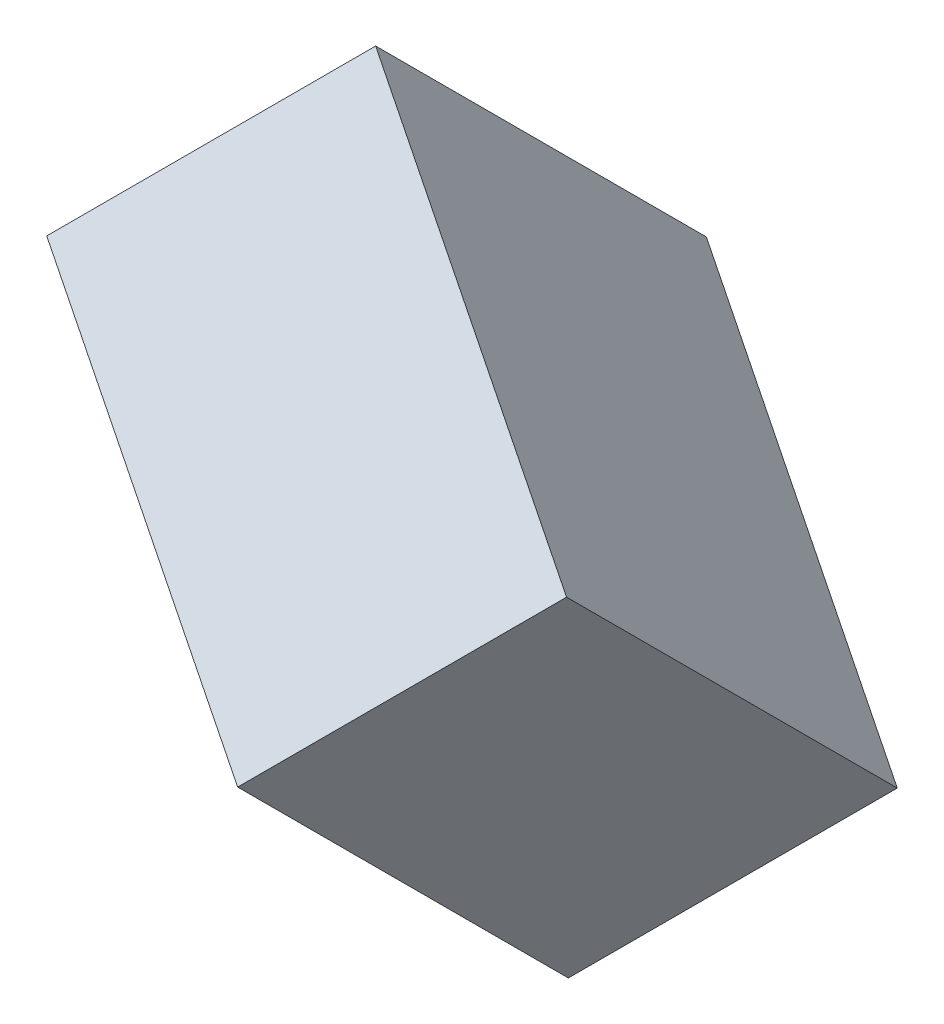
ISO-10303-21;
HEADER;
FILE_DESCRIPTION(('STEP AP214'),'2;1');
FILE_NAME('part.step','',(''),(''),'','','');
FILE_SCHEMA(('AUTOMOTIVE_DESIGN { 1 0 10303 214 1 1 1 1 }'));
ENDSEC;
DATA;
#1=APPLICATION_CONTEXT('core data for automotive mechanical design processes');
#2=APPLICATION_PROTOCOL_DEFINITION('international standard','automotive_design',2000,#1);
#3=PRODUCT_CONTEXT('',#1,'mechanical');
#4=PRODUCT('Part','Part','',(#3));
#5=PRODUCT_RELATED_PRODUCT_CATEGORY('part','',(#4));
#6=PRODUCT_DEFINITION_FORMATION('','',#4);
#7=PRODUCT_DEFINITION_CONTEXT('part definition',#1,'design');
#8=PRODUCT_DEFINITION('design','',#6,#7);
#9=PRODUCT_DEFINITION_SHAPE('','',#8);
#10=(LENGTH_UNIT() NAMED_UNIT(*) SI_UNIT(.MILLI.,.METRE.));
#11=(NAMED_UNIT(*) PLANE_ANGLE_UNIT() SI_UNIT($,.RADIAN.));
#12=(NAMED_UNIT(*) SI_UNIT($,.STERADIAN.) SOLID_ANGLE_UNIT());
#13=UNCERTAINTY_MEASURE_WITH_UNIT(LENGTH_MEASURE(1.E-05),#10,'distance_accuracy_value','');
#14=(GEOMETRIC_REPRESENTATION_CONTEXT(3) GLOBAL_UNCERTAINTY_ASSIGNED_CONTEXT((#13)) GLOBAL_UNIT_ASSIGNED_CONTEXT((#10,
#11,#12)) REPRESENTATION_CONTEXT('',''));
#15=CARTESIAN_POINT('',(0.,0.,0.));
#16=DIRECTION('',(0.,0.,1.));
#17=DIRECTION('',(1.,0.,0.));
#18=AXIS2_PLACEMENT_3D('',#15,#16,#17);
#19=CARTESIAN_POINT('',(22.8158049250269,22.8158059363306,-22.8157720901868));
#20=DIRECTION('',(-0.577350537619435,-0.577350563210324,0.577349706738708));
#21=DIRECTION('',(0.707106796857695,-0.7071067655154,0.));
#22=AXIS2_PLACEMENT_3D('',#19,#20,#21);
#23=PLANE('',#22);
#24=DIRECTION('',(-0.707106272377781,0.,-0.707107289994949));
#25=VECTOR('',#24,1.);
#26=CARTESIAN_POINT('',(9.04658788701765,50.3541991604437,-9.04657486782906));
#27=LINE('',#26,#25);
#28=CARTESIAN_POINT('',(24.8615788817128,50.3541991604437,6.76843888667884));
#29=VERTEX_POINT('',#28);
#30=CARTESIAN_POINT('',(-8.80153690732209,50.3541991604437,-26.8947253479234));
#31=VERTEX_POINT('',#30);
#32=EDGE_CURVE('E304',#29,#31,#27,.T.);
#33=ORIENTED_EDGE('',*,*,#32,.F.);
#34=DIRECTION('',(0.,0.707106256706622,0.707107305666085));
#35=VECTOR('',#34,1.);
#36=CARTESIAN_POINT('',(24.8615788817128,21.7929174859225,-21.7928851571842));
#37=LINE('',#36,#35);
#38=CARTESIAN_POINT('',(24.8615788817128,16.6910848635162,-26.8947253479235));
#39=VERTEX_POINT('',#38);
#40=EDGE_CURVE('E338',#39,#29,#37,.T.);
#41=ORIENTED_EDGE('',*,*,#40,.F.);
#42=DIRECTION('',(0.707106796857694,-0.7071067655154,0.));
#43=VECTOR('',#42,1.);
#44=CARTESIAN_POINT('',(20.7763313216235,20.7763322425281,-26.8947253479235));
#45=LINE('',#44,#43);
#46=EDGE_CURVE('E333',#31,#39,#45,.T.);
#47=ORIENTED_EDGE('',*,*,#46,.F.);
#48=EDGE_LOOP('',(#33,#41,#47));
#49=FACE_BOUND('',#48,.T.);
#50=DIRECTION('',(0.,0.707106256706622,0.707107305666085));
#51=VECTOR('',#50,1.);
#52=CARTESIAN_POINT('',(36.0941758460175,8.460881224255,-23.8923280668504));
#53=LINE('',#52,#51);
#54=CARTESIAN_POINT('',(36.0941758460175,8.460881224255,-23.8923280668504));
#55=VERTEX_POINT('',#54);
#56=CARTESIAN_POINT('',(36.0941758460174,47.3517253431192,14.9985737447843));
#57=VERTEX_POINT('',#56);
#58=EDGE_CURVE('E307',#55,#57,#53,.T.);
#59=ORIENTED_EDGE('',*,*,#58,.T.);
#60=DIRECTION('',(-0.816496391119122,0.408248783080944,-0.408248177463634));
#61=VECTOR('',#60,1.);
#62=CARTESIAN_POINT('',(36.0941758460174,47.3517253431192,14.9985737447843));
#63=LINE('',#62,#61);
#64=CARTESIAN_POINT('',(-8.81312566553424,69.8054084125711,-7.45507601571559));
#65=VERTEX_POINT('',#64);
#66=EDGE_CURVE('E309',#57,#65,#63,.T.);
#67=ORIENTED_EDGE('',*,*,#66,.T.);
#68=DIRECTION('',(0.,-0.707106256706621,-0.707107305666085));
#69=VECTOR('',#68,1.);
#70=CARTESIAN_POINT('',(-8.81312566553425,30.9145642937069,-46.3459778273503));
#71=LINE('',#70,#69);
#72=CARTESIAN_POINT('',(-8.81312566553425,30.9145642937069,-46.3459778273503));
#73=VERTEX_POINT('',#72);
#74=EDGE_CURVE('E403',#65,#73,#71,.T.);
#75=ORIENTED_EDGE('',*,*,#74,.T.);
#76=DIRECTION('',(0.816496391119122,-0.408248783080944,0.408248177463634));
#77=VECTOR('',#76,1.);
#78=CARTESIAN_POINT('',(36.0941758460175,8.460881224255,-23.8923280668504));
#79=LINE('',#78,#77);
#80=EDGE_CURVE('E312',#73,#55,#79,.T.);
#81=ORIENTED_EDGE('',*,*,#80,.T.);
#82=EDGE_LOOP('',(#59,#67,#75,#81));
#83=FACE_BOUND('',#82,.T.);
#84=ADVANCED_FACE('F43',(#49,#83),#23,.T.);
#85=CARTESIAN_POINT('',(36.0941758460175,8.460881224255,-23.8923280668504));
#86=DIRECTION('',(-0.816496391119122,0.408248783080944,-0.408248177463634));
#87=DIRECTION('',(-0.447214110377798,-0.89442693356081,0.));
#88=AXIS2_PLACEMENT_3D('',#85,#86,#87);
#89=PLANE('',#88);
#90=DIRECTION('',(0.,0.707106256706622,0.707107305666085));
#91=VECTOR('',#90,1.);
#92=CARTESIAN_POINT('',(55.4354188562685,27.8021250918008,-43.2335432425971));
#93=LINE('',#92,#91);
#94=CARTESIAN_POINT('',(55.4354188562685,27.8021250918008,-43.2335432425971));
#95=VERTEX_POINT('',#94);
#96=CARTESIAN_POINT('',(55.4354188562685,66.692969210665,-4.34264143096244));
#97=VERTEX_POINT('',#96);
#98=EDGE_CURVE('E320',#95,#97,#93,.T.);
#99=ORIENTED_EDGE('',*,*,#98,.T.);
#100=DIRECTION('',(0.577350537619435,0.577350563210324,-0.577349706738708));
#101=VECTOR('',#100,1.);
#102=CARTESIAN_POINT('',(36.0941758460174,47.3517253431192,14.9985737447843));
#103=LINE('',#102,#101);
#104=EDGE_CURVE('E318',#57,#97,#103,.T.);
#105=ORIENTED_EDGE('',*,*,#104,.F.);
#106=ORIENTED_EDGE('',*,*,#58,.F.);
#107=DIRECTION('',(0.577350537619435,0.577350563210324,-0.577349706738708));
#108=VECTOR('',#107,1.);
#109=CARTESIAN_POINT('',(36.0941758460175,8.460881224255,-23.8923280668504));
#110=LINE('',#109,#108);
#111=EDGE_CURVE('E327',#55,#95,#110,.T.);
#112=ORIENTED_EDGE('',*,*,#111,.T.);
#113=EDGE_LOOP('',(#99,#105,#106,#112));
#114=FACE_BOUND('',#113,.T.);
#115=ADVANCED_FACE('F248',(#114),#89,.F.);
#116=CARTESIAN_POINT('',(36.0941758460174,47.3517253431192,14.9985737447843));
#117=DIRECTION('',(0.,-0.707106256706621,-0.707107305666084));
#118=DIRECTION('',(0.,0.707107305666085,-0.707106256706622));
#119=AXIS2_PLACEMENT_3D('',#116,#117,#118);
#120=PLANE('',#119);
#121=DIRECTION('',(-0.816496391119122,0.408248783080944,-0.408248177463634));
#122=VECTOR('',#121,1.);
#123=CARTESIAN_POINT('',(55.4354188562685,66.692969210665,-4.34264143096244));
#124=LINE('',#123,#122);
#125=CARTESIAN_POINT('',(10.5281173447168,89.1466522801169,-26.7962911914623));
#126=VERTEX_POINT('',#125);
#127=EDGE_CURVE('E323',#97,#126,#124,.T.);
#128=ORIENTED_EDGE('',*,*,#127,.T.);
#129=DIRECTION('',(0.577350537619435,0.577350563210324,-0.577349706738708));
#130=VECTOR('',#129,1.);
#131=CARTESIAN_POINT('',(-8.81312566553424,69.8054084125711,-7.45507601571559));
#132=LINE('',#131,#130);
#133=EDGE_CURVE('E325',#65,#126,#132,.T.);
#134=ORIENTED_EDGE('',*,*,#133,.F.);
#135=ORIENTED_EDGE('',*,*,#66,.F.);
#136=ORIENTED_EDGE('',*,*,#104,.T.);
#137=EDGE_LOOP('',(#128,#134,#135,#136));
#138=FACE_BOUND('',#137,.T.);
#139=ADVANCED_FACE('F298',(#138),#120,.F.);
#140=CARTESIAN_POINT('',(-8.81312566553425,30.9145642937069,-46.3459778273503));
#141=DIRECTION('',(0.816496391119122,-0.408248783080944,0.408248177463634));
#142=DIRECTION('',(0.447214110377799,0.89442693356081,0.));
#143=AXIS2_PLACEMENT_3D('',#140,#141,#142);
#144=PLANE('',#143);
#145=DIRECTION('',(0.,-0.707106256706621,-0.707107305666085));
#146=VECTOR('',#145,1.);
#147=CARTESIAN_POINT('',(10.5281173447168,50.2558081612528,-65.687193003097));
#148=LINE('',#147,#146);
#149=CARTESIAN_POINT('',(10.5281173447168,50.2558081612528,-65.687193003097));
#150=VERTEX_POINT('',#149);
#151=EDGE_CURVE('E322',#126,#150,#148,.T.);
#152=ORIENTED_EDGE('',*,*,#151,.T.);
#153=DIRECTION('',(0.577350537619435,0.577350563210324,-0.577349706738708));
#154=VECTOR('',#153,1.);
#155=CARTESIAN_POINT('',(-8.81312566553425,30.9145642937069,-46.3459778273503));
#156=LINE('',#155,#154);
#157=EDGE_CURVE('E337',#73,#150,#156,.T.);
#158=ORIENTED_EDGE('',*,*,#157,.F.);
#159=ORIENTED_EDGE('',*,*,#74,.F.);
#160=ORIENTED_EDGE('',*,*,#133,.T.);
#161=EDGE_LOOP('',(#152,#158,#159,#160));
#162=FACE_BOUND('',#161,.T.);
#163=ADVANCED_FACE('F420',(#162),#144,.F.);
#164=CARTESIAN_POINT('',(36.0941758460175,8.460881224255,-23.8923280668504));
#165=DIRECTION('',(0.,0.707106256706621,0.707107305666085));
#166=DIRECTION('',(0.,-0.707107305666085,0.707106256706621));
#167=AXIS2_PLACEMENT_3D('',#164,#165,#166);
#168=PLANE('',#167);
#169=DIRECTION('',(0.816496391119122,-0.408248783080944,0.408248177463634));
#170=VECTOR('',#169,1.);
#171=CARTESIAN_POINT('',(55.4354188562685,27.8021250918008,-43.2335432425971));
#172=LINE('',#171,#170);
#173=EDGE_CURVE('E407',#150,#95,#172,.T.);
#174=ORIENTED_EDGE('',*,*,#173,.T.);
#175=ORIENTED_EDGE('',*,*,#111,.F.);
#176=ORIENTED_EDGE('',*,*,#80,.F.);
#177=ORIENTED_EDGE('',*,*,#157,.T.);
#178=EDGE_LOOP('',(#174,#175,#176,#177));
#179=FACE_BOUND('',#178,.T.);
#180=ADVANCED_FACE('F413',(#179),#168,.F.);
#181=CARTESIAN_POINT('',(42.157047935278,42.1570498038765,-42.1569872659335));
#182=DIRECTION('',(-0.577350537619435,-0.577350563210324,0.577349706738708));
#183=DIRECTION('',(0.707106796857695,-0.7071067655154,0.));
#184=AXIS2_PLACEMENT_3D('',#181,#182,#183);
#185=PLANE('',#184);
#186=ORIENTED_EDGE('',*,*,#98,.F.);
#187=ORIENTED_EDGE('',*,*,#173,.F.);
#188=ORIENTED_EDGE('',*,*,#151,.F.);
#189=ORIENTED_EDGE('',*,*,#127,.F.);
#190=EDGE_LOOP('',(#186,#187,#188,#189));
#191=FACE_BOUND('',#190,.T.);
#192=ADVANCED_FACE('F418',(#191),#185,.F.);
#193=CARTESIAN_POINT('',(24.8615788817128,23.0541991604437,-26.8947253479235));
#194=DIRECTION('',(0.,0.,-1.));
#195=DIRECTION('',(0.,1.,0.));
#196=AXIS2_PLACEMENT_3D('',#193,#194,#195);
#197=PLANE('',#196);
#198=CARTESIAN_POINT('',(8.3615660689426,35.8541862944833,-26.8947253479235));
#199=CARTESIAN_POINT('',(8.36156639598209,35.7987452668269,-26.8947253479235));
#200=CARTESIAN_POINT('',(8.36387267016577,35.7433300835326,-26.8947253479235));
#201=CARTESIAN_POINT('',(8.37307416502283,35.6328845206701,-26.8947253479235));
#202=CARTESIAN_POINT('',(8.37996918599046,35.5778541244608,-26.8947253479235));
#203=CARTESIAN_POINT('',(8.40748778761155,35.4139246170889,-26.8947253479235));
#204=CARTESIAN_POINT('',(8.4349449910057,35.3060926576647,-26.8947253479235));
#205=CARTESIAN_POINT('',(8.50731573317348,35.0965152093663,-26.8947253479235));
#206=CARTESIAN_POINT('',(8.55222926268645,34.9947697172632,-26.8947253479235));
#207=CARTESIAN_POINT('',(8.65827929856678,34.8001004585484,-26.8947253479235));
#208=CARTESIAN_POINT('',(8.71941579645956,34.7071766873284,-26.8947253479235));
#209=CARTESIAN_POINT('',(8.85622338243988,34.5327329648341,-26.8947253479235));
#210=CARTESIAN_POINT('',(8.93189446388477,34.451213008348,-26.8947253479235));
#211=CARTESIAN_POINT('',(9.09568725059705,34.301819760747,-26.8947253479235));
#212=CARTESIAN_POINT('',(9.1838089516114,34.2339464649705,-26.8947253479235));
#213=CARTESIAN_POINT('',(9.37006201496507,34.1137216758363,-26.8947253479235));
#214=CARTESIAN_POINT('',(9.46819337541521,34.0613701795492,-26.8947253479235));
#215=CARTESIAN_POINT('',(9.67179782978168,33.9736259908587,-26.8947253479234));
#216=CARTESIAN_POINT('',(9.77727092358642,33.9382332981975,-26.8947253479235));
#217=CARTESIAN_POINT('',(9.9627621583997,33.8927074563183,-26.8947253479235));
#218=CARTESIAN_POINT('',(10.0417588364109,33.8782965694851,-26.8947253479235));
#219=CARTESIAN_POINT('',(10.2010131149251,33.8590205959407,-26.8947253479234));
#220=CARTESIAN_POINT('',(10.281272232858,33.8541680497576,-26.8947253479234));
#221=CARTESIAN_POINT('',(10.3615645398647,33.8541847654057,-26.8947253479233));
#222=B_SPLINE_CURVE_WITH_KNOTS('',3,(#198,#199,#200,#201,#202,#203,#204,#205,#206,#207,#208,
#209,#210,#211,#212,#213,#214,#215,#216,#217,#218,#219,#220,#221),.UNSPECIFIED.,.F.,.F.,(4,2,2,
2,2,2,2,2,2,2,2,4),(0.,0.166223775937425,0.332440318162865,0.664593321477084,0.996746148582956,
1.32889880217869,1.66105130397308,1.9932036923069,2.3253560179521,2.65750833854907,
2.89785994379603,3.13852668049027),.UNSPECIFIED.);
#223=CARTESIAN_POINT('',(8.36156606894261,35.8541862944833,-26.8947253479235));
#224=VERTEX_POINT('',#223);
#225=CARTESIAN_POINT('',(10.3615645398649,33.8541847654059,-26.8947253479235));
#226=VERTEX_POINT('',#225);
#227=EDGE_CURVE('E200',#224,#226,#222,.T.);
#228=ORIENTED_EDGE('',*,*,#227,.F.);
#229=DIRECTION('',(-7.64538399963104E-07,-0.999999999999708,0.));
#230=VECTOR('',#229,1.);
#231=CARTESIAN_POINT('',(8.36160892436794,91.9081730138131,-26.8947253479235));
#232=LINE('',#231,#230);
#233=CARTESIAN_POINT('',(8.36158316064785,50.3541991604437,-26.8947253479234));
#234=VERTEX_POINT('',#233);
#235=EDGE_CURVE('E188',#234,#224,#232,.T.);
#236=ORIENTED_EDGE('',*,*,#235,.F.);
#237=DIRECTION('',(1.,0.,0.));
#238=VECTOR('',#237,1.);
#239=CARTESIAN_POINT('',(-2.43842111828726,50.3541991604437,-26.8947253479234));
#240=LINE('',#239,#238);
#241=EDGE_CURVE('E187',#31,#234,#240,.T.);
#242=ORIENTED_EDGE('',*,*,#241,.F.);
#243=ORIENTED_EDGE('',*,*,#46,.T.);
#244=DIRECTION('',(0.,1.,0.));
#245=VECTOR('',#244,1.);
#246=CARTESIAN_POINT('',(24.8615788817128,23.0541991604437,-26.8947253479235));
#247=LINE('',#246,#245);
#248=CARTESIAN_POINT('',(24.8615717135476,33.8541919390886,-26.8947253479235));
#249=VERTEX_POINT('',#248);
#250=EDGE_CURVE('E336',#39,#249,#247,.T.);
#251=ORIENTED_EDGE('',*,*,#250,.T.);
#252=DIRECTION('',(1.,0.,0.));
#253=VECTOR('',#252,1.);
#254=CARTESIAN_POINT('',(61.0821843638305,33.8541847709232,-26.8947253479235));
#255=LINE('',#254,#253);
#256=EDGE_CURVE('E203',#226,#249,#255,.T.);
#257=ORIENTED_EDGE('',*,*,#256,.F.);
#258=EDGE_LOOP('',(#228,#236,#242,#243,#251,#257));
#259=FACE_BOUND('',#258,.T.);
#260=ADVANCED_FACE('F431',(#259),#197,.F.);
#261=CARTESIAN_POINT('',(24.8615788817128,23.0541991604437,-21.2947253479234));
#262=DIRECTION('',(1.,0.,0.));
#263=DIRECTION('',(0.,0.,-1.));
#264=AXIS2_PLACEMENT_3D('',#261,#262,#263);
#265=PLANE('',#264);
#266=CARTESIAN_POINT('',(24.8615788817128,33.854199107254,-12.3947270748758));
#267=CARTESIAN_POINT('',(24.8615788817128,33.8541994766617,-12.3392861201116));
#268=CARTESIAN_POINT('',(24.8615788817128,33.856505790691,-12.2838710115079));
#269=CARTESIAN_POINT('',(24.8615788817128,33.865707358914,-12.1734256012896));
#270=CARTESIAN_POINT('',(24.8615788817128,33.8726024133831,-12.1183952830323));
#271=CARTESIAN_POINT('',(24.8615788817128,33.9001211128774,-11.9544659605401));
#272=CARTESIAN_POINT('',(24.8615788817128,33.9275783780362,-11.8466341131094));
#273=CARTESIAN_POINT('',(24.8615788817128,33.9999492389686,-11.637056840295));
#274=CARTESIAN_POINT('',(24.8615788817128,34.0448628347422,-11.5353114149114));
#275=CARTESIAN_POINT('',(24.8615788817128,34.1509130145123,-11.3406422464367));
#276=CARTESIAN_POINT('',(24.8615788817128,34.2120495985086,-11.2477185033455));
#277=CARTESIAN_POINT('',(24.8615788817128,34.3488573784668,-11.0732748082205));
#278=CARTESIAN_POINT('',(24.8615788817128,34.4245285744286,-10.9917548561867));
#279=CARTESIAN_POINT('',(24.8615788817128,34.5883216133369,-10.8423616080331));
#280=CARTESIAN_POINT('',(24.8615788817128,34.6764434562833,-10.7744883119134));
#281=CARTESIAN_POINT('',(24.8615788817128,34.8626968177849,-10.6542635320934));
#282=CARTESIAN_POINT('',(24.8615788817128,34.9608283363401,-10.6019120483932));
#283=CARTESIAN_POINT('',(24.8615788817128,35.164433104187,-10.5141679093016));
#284=CARTESIAN_POINT('',(24.8615788817128,35.2699063534786,-10.4787752539103));
#285=CARTESIAN_POINT('',(24.8615788817128,35.4553975841986,-10.4332495633614));
#286=CARTESIAN_POINT('',(24.8615788817128,35.5343940972097,-10.4188387525381));
#287=CARTESIAN_POINT('',(24.8615788817128,35.6936480345179,-10.3995628805369));
#288=CARTESIAN_POINT('',(24.8615788817127,35.7739069762144,-10.3947103596756));
#289=CARTESIAN_POINT('',(24.8615788817126,35.8541991072538,-10.3947270748757));
#290=B_SPLINE_CURVE_WITH_KNOTS('',3,(#266,#267,#268,#269,#270,#271,#272,#273,#274,#275,#276,
#277,#278,#279,#280,#281,#282,#283,#284,#285,#286,#287,#288,#289),.UNSPECIFIED.,.F.,.F.,(4,2,2,
2,2,2,2,2,2,2,2,4),(0.,0.16622355727992,0.332439880167641,0.664592604927288,0.996745329686934,
1.32889805444657,1.66105077920621,1.99320350396585,2.3253562287255,2.65750895348513,
2.89786003593041,3.13852624549417),.UNSPECIFIED.);
#291=CARTESIAN_POINT('',(24.8615788817128,33.854199107254,-12.3947270748758));
#292=VERTEX_POINT('',#291);
#293=CARTESIAN_POINT('',(24.8615788817128,35.854199107254,-10.3947270748758));
#294=VERTEX_POINT('',#293);
#295=EDGE_CURVE('E275',#292,#294,#290,.T.);
#296=ORIENTED_EDGE('',*,*,#295,.F.);
#297=DIRECTION('',(0.,0.,1.));
#298=VECTOR('',#297,1.);
#299=CARTESIAN_POINT('',(24.8615788817127,33.854199107254,-68.4486162186449));
#300=LINE('',#299,#298);
#301=EDGE_CURVE('E207',#249,#292,#300,.T.);
#302=ORIENTED_EDGE('',*,*,#301,.F.);
#303=ORIENTED_EDGE('',*,*,#250,.F.);
#304=ORIENTED_EDGE('',*,*,#40,.T.);
#305=DIRECTION('',(0.,0.,-1.));
#306=VECTOR('',#305,1.);
#307=CARTESIAN_POINT('',(24.8615788817128,50.3541991604437,0.40527465207656));
#308=LINE('',#307,#306);
#309=CARTESIAN_POINT('',(24.8615789349024,50.3541991604437,-10.3947271280653));
#310=VERTEX_POINT('',#309);
#311=EDGE_CURVE('E340',#29,#310,#308,.T.);
#312=ORIENTED_EDGE('',*,*,#311,.T.);
#313=DIRECTION('',(0.,1.,0.));
#314=VECTOR('',#313,1.);
#315=CARTESIAN_POINT('',(24.8615788817128,82.2414715852165,-10.3947270748758));
#316=LINE('',#315,#314);
#317=EDGE_CURVE('E211',#294,#310,#316,.T.);
#318=ORIENTED_EDGE('',*,*,#317,.F.);
#319=EDGE_LOOP('',(#296,#302,#303,#304,#312,#318));
#320=FACE_BOUND('',#319,.T.);
#321=ADVANCED_FACE('F432',(#320),#265,.F.);
#322=CARTESIAN_POINT('',(-2.43842111828726,50.3541991604437,-26.8947253479234));
#323=DIRECTION('',(0.,1.,0.));
#324=DIRECTION('',(-1.,0.,0.));
#325=AXIS2_PLACEMENT_3D('',#322,#323,#324);
#326=PLANE('',#325);
#327=ORIENTED_EDGE('',*,*,#241,.T.);
#328=DIRECTION('',(-7.6453843470117E-07,0.,-0.999999999999708));
#329=VECTOR('',#328,1.);
#330=CARTESIAN_POINT('',(8.36155124292705,50.3541991604436,-63.1152413475106));
#331=LINE('',#330,#329);
#332=CARTESIAN_POINT('',(8.36158505120041,50.3541991604437,-18.894739360653));
#333=VERTEX_POINT('',#332);
#334=EDGE_CURVE('E168',#333,#234,#331,.T.);
#335=ORIENTED_EDGE('',*,*,#334,.F.);
#336=DIRECTION('',(9.40967159604717E-07,0.,-0.999999999999557));
#337=VECTOR('',#336,1.);
#338=CARTESIAN_POINT('',(8.36162258377936,50.3541991604436,-58.7819751336039));
#339=LINE('',#338,#337);
#340=CARTESIAN_POINT('',(8.36157893490237,50.3541991604437,-12.3947271280653));
#341=VERTEX_POINT('',#340);
#342=EDGE_CURVE('E178',#341,#333,#339,.T.);
#343=ORIENTED_EDGE('',*,*,#342,.F.);
#344=CARTESIAN_POINT('',(10.3615789349024,50.3541991604437,-10.3947271280653));
#345=CARTESIAN_POINT('',(10.3061379801381,50.3541991604437,-10.394727497473));
#346=CARTESIAN_POINT('',(10.2507228715345,50.3541991604437,-10.3970338115023));
#347=CARTESIAN_POINT('',(10.1402774613162,50.3541991604437,-10.4062353797253));
#348=CARTESIAN_POINT('',(10.0852471430589,50.3541991604437,-10.4131304341944));
#349=CARTESIAN_POINT('',(9.92131782056662,50.3541991604437,-10.4406491336887));
#350=CARTESIAN_POINT('',(9.81348597313592,50.3541991604437,-10.4681063988475));
#351=CARTESIAN_POINT('',(9.60390870032162,50.3541991604437,-10.5404772597799));
#352=CARTESIAN_POINT('',(9.50216327493802,50.3541991604437,-10.5853908555535));
#353=CARTESIAN_POINT('',(9.30749410646326,50.3541991604437,-10.6914410353236));
#354=CARTESIAN_POINT('',(9.21457036337211,50.3541991604437,-10.7525776193199));
#355=CARTESIAN_POINT('',(9.04012666824713,50.3541991604437,-10.8893853992781));
#356=CARTESIAN_POINT('',(8.95860671621329,50.3541991604437,-10.9650565952399));
#357=CARTESIAN_POINT('',(8.80921346805971,50.3541991604437,-11.1288496341482));
#358=CARTESIAN_POINT('',(8.74134017193995,50.3541991604437,-11.2169714770946));
#359=CARTESIAN_POINT('',(8.62111539211997,50.3541991604437,-11.4032248385962));
#360=CARTESIAN_POINT('',(8.56876390841973,50.3541991604437,-11.5013563571514));
#361=CARTESIAN_POINT('',(8.48101976932818,50.3541991604437,-11.7049611249983));
#362=CARTESIAN_POINT('',(8.44562711393685,50.3541991604437,-11.8104343742899));
#363=CARTESIAN_POINT('',(8.400101423388,50.3541991604437,-11.9959256050099));
#364=CARTESIAN_POINT('',(8.38569061256466,50.3541991604437,-12.074922118021));
#365=CARTESIAN_POINT('',(8.36641474056348,50.3541991604437,-12.2341760553292));
#366=CARTESIAN_POINT('',(8.36156221970215,50.3541991604436,-12.3144349970257));
#367=CARTESIAN_POINT('',(8.36157893490223,50.3541991604435,-12.3947271280651));
#368=B_SPLINE_CURVE_WITH_KNOTS('',3,(#344,#345,#346,#347,#348,#349,#350,#351,#352,#353,#354,
#355,#356,#357,#358,#359,#360,#361,#362,#363,#364,#365,#366,#367),.UNSPECIFIED.,.F.,.F.,(4,2,2,
2,2,2,2,2,2,2,2,4),(0.,0.166223557279914,0.332439880167633,0.664592604927272,0.996745329686908,
1.32889805444654,1.66105077920618,1.99320350396581,2.32535622872545,2.65750895348508,
2.89786003593039,3.13852624549416),.UNSPECIFIED.);
#369=CARTESIAN_POINT('',(10.3615789349024,50.3541991604437,-10.3947271280653));
#370=VERTEX_POINT('',#369);
#371=EDGE_CURVE('E222',#370,#341,#368,.T.);
#372=ORIENTED_EDGE('',*,*,#371,.F.);
#373=DIRECTION('',(-1.,0.,0.));
#374=VECTOR('',#373,1.);
#375=CARTESIAN_POINT('',(66.41551126164,50.3541991604436,-10.3947271280653));
#376=LINE('',#375,#374);
#377=EDGE_CURVE('E219',#310,#370,#376,.T.);
#378=ORIENTED_EDGE('',*,*,#377,.F.);
#379=ORIENTED_EDGE('',*,*,#311,.F.);
#380=ORIENTED_EDGE('',*,*,#32,.T.);
#381=EDGE_LOOP('',(#327,#335,#343,#372,#378,#379,#380));
#382=FACE_BOUND('',#381,.T.);
#383=ADVANCED_FACE('F185',(#382),#326,.F.);
#384=CARTESIAN_POINT('',(52.5821844854889,94.5748005547969,-63.1152751558844));
#385=DIRECTION('',(-0.707106526552882,0.707107035819914,5.40610116101713E-07));
#386=DIRECTION('',(-0.707107035820018,-0.707106526552986,0.));
#387=AXIS2_PLACEMENT_3D('',#384,#385,#386);
#388=PLANE('',#387);
#389=DIRECTION('',(0.,-7.6453788170373E-07,0.999999999999708));
#390=VECTOR('',#389,1.);
#391=CARTESIAN_POINT('',(9.56157888171274,51.5541991604437,-28.0947253479235));
#392=LINE('',#391,#390);
#393=CARTESIAN_POINT('',(9.56157888171274,51.5541991604437,-28.0947253479235));
#394=VERTEX_POINT('',#393);
#395=CARTESIAN_POINT('',(9.56157888171274,51.5541930441453,-20.0947314642218));
#396=VERTEX_POINT('',#395);
#397=EDGE_CURVE('E171',#394,#396,#392,.T.);
#398=ORIENTED_EDGE('',*,*,#397,.T.);
#399=DIRECTION('',(-0.577350537619435,-0.577350563210324,0.577349706738708));
#400=VECTOR('',#399,1.);
#401=CARTESIAN_POINT('',(52.5821844854889,94.5748005547969,-63.1152751558844));
#402=LINE('',#401,#400);
#403=EDGE_CURVE('E164',#396,#333,#402,.T.);
#404=ORIENTED_EDGE('',*,*,#403,.T.);
#405=ORIENTED_EDGE('',*,*,#334,.T.);
#406=DIRECTION('',(-0.577350537619435,-0.577350563210324,0.577349706738708));
#407=VECTOR('',#406,1.);
#408=CARTESIAN_POINT('',(49.9155191768458,91.908141244253,-68.4486075686129));
#409=LINE('',#408,#407);
#410=EDGE_CURVE('E197',#394,#234,#409,.T.);
#411=ORIENTED_EDGE('',*,*,#410,.F.);
#412=EDGE_LOOP('',(#398,#404,#405,#411));
#413=FACE_BOUND('',#412,.T.);
#414=ADVANCED_FACE('F166',(#413),#388,.F.);
#415=CARTESIAN_POINT('',(49.9155191768458,91.908141244253,-68.4486075686129));
#416=DIRECTION('',(-0.707106542683079,5.40610104746292E-07,-0.707107019689729));
#417=DIRECTION('',(-0.707107019689833,0.,0.707106542683182));
#418=AXIS2_PLACEMENT_3D('',#415,#416,#417);
#419=PLANE('',#418);
#420=ORIENTED_EDGE('',*,*,#235,.T.);
#421=DIRECTION('',(-0.577350537619435,-0.577350563210324,0.577349706738708));
#422=VECTOR('',#421,1.);
#423=CARTESIAN_POINT('',(54.7488535235145,82.2414758051578,-73.2819460452991));
#424=LINE('',#423,#422);
#425=CARTESIAN_POINT('',(9.56157888171272,37.0541991604437,-28.0947364337228));
#426=VERTEX_POINT('',#425);
#427=EDGE_CURVE('E201',#426,#224,#424,.T.);
#428=ORIENTED_EDGE('',*,*,#427,.F.);
#429=DIRECTION('',(0.,0.999999999999708,7.64537882137411E-07));
#430=VECTOR('',#429,1.);
#431=CARTESIAN_POINT('',(9.56157888171274,51.5541991604437,-28.0947253479235));
#432=LINE('',#431,#430);
#433=EDGE_CURVE('E191',#426,#394,#432,.T.);
#434=ORIENTED_EDGE('',*,*,#433,.T.);
#435=ORIENTED_EDGE('',*,*,#410,.T.);
#436=EDGE_LOOP('',(#420,#428,#434,#435));
#437=FACE_BOUND('',#436,.T.);
#438=ADVANCED_FACE('F252',(#437),#419,.F.);
#439=CARTESIAN_POINT('',(56.0821862369356,81.5748084890291,-72.6152797181391));
#440=DIRECTION('',(-0.577350537619435,-0.577350563210324,0.577349706738708));
#441=DIRECTION('',(-0.707106526552883,0.707107035819914,5.4061011575679E-07));
#442=AXIS2_PLACEMENT_3D('',#439,#440,#441);
#443=ELLIPSE('',#442,2.,1.15470029628983);
#444=DIRECTION('',(-0.577350537619435,-0.577350563210324,0.577349706738708));
#445=VECTOR('',#444,1.);
#446=SURFACE_OF_LINEAR_EXTRUSION('',#443,#445);
#447=ORIENTED_EDGE('',*,*,#227,.T.);
#448=DIRECTION('',(-0.577350537619435,-0.577350563210324,0.577349706738708));
#449=VECTOR('',#448,1.);
#450=CARTESIAN_POINT('',(56.7488530433727,80.2414753250162,-73.2819470942335));
#451=LINE('',#450,#449);
#452=CARTESIAN_POINT('',(11.561578881713,35.0541991604442,-28.0947379627985));
#453=VERTEX_POINT('',#452);
#454=EDGE_CURVE('E205',#453,#226,#451,.T.);
#455=ORIENTED_EDGE('',*,*,#454,.F.);
#456=CARTESIAN_POINT('',(11.5615788817127,37.0541991604437,-28.0947364337228));
#457=DIRECTION('',(0.,-7.64537882137411E-07,0.999999999999708));
#458=DIRECTION('',(0.,-0.999999999999708,-7.64537882137411E-07));
#459=AXIS2_PLACEMENT_3D('',#456,#457,#458);
#460=CIRCLE('',#459,2.);
#461=EDGE_CURVE('E204',#453,#426,#460,.F.);
#462=ORIENTED_EDGE('',*,*,#461,.T.);
#463=ORIENTED_EDGE('',*,*,#427,.T.);
#464=EDGE_LOOP('',(#447,#455,#462,#463));
#465=FACE_BOUND('',#464,.T.);
#466=ADVANCED_FACE('F45',(#465),#446,.F.);
#467=CARTESIAN_POINT('',(61.0821843638305,78.0748065494368,-71.1152815272851));
#468=DIRECTION('',(0.,-0.707106256706622,-0.707107305666084));
#469=DIRECTION('',(0.,0.707107305666084,-0.707106256706622));
#470=AXIS2_PLACEMENT_3D('',#467,#468,#469);
#471=PLANE('',#470);
#472=ORIENTED_EDGE('',*,*,#256,.T.);
#473=DIRECTION('',(-0.577350537619435,-0.577350563210324,0.577349706738708));
#474=VECTOR('',#473,1.);
#475=CARTESIAN_POINT('',(66.4155152175149,75.4081372849219,-68.448616218645));
#476=LINE('',#475,#474);
#477=CARTESIAN_POINT('',(26.0615788817128,35.0541991604437,-28.0947379572807));
#478=VERTEX_POINT('',#477);
#479=EDGE_CURVE('E232',#478,#249,#476,.T.);
#480=ORIENTED_EDGE('',*,*,#479,.F.);
#481=DIRECTION('',(-1.,0.,0.));
#482=VECTOR('',#481,1.);
#483=CARTESIAN_POINT('',(26.0615788817128,35.0541991604437,-28.0947379572807));
#484=LINE('',#483,#482);
#485=CARTESIAN_POINT('',(18.0615788817128,35.0541991604437,-28.0947379572807));
#486=VERTEX_POINT('',#485);
#487=EDGE_CURVE('E349',#478,#486,#484,.T.);
#488=ORIENTED_EDGE('',*,*,#487,.T.);
#489=DIRECTION('',(-1.,0.,0.));
#490=VECTOR('',#489,1.);
#491=CARTESIAN_POINT('',(26.0615788817128,35.0541991604437,-28.0947379627985));
#492=LINE('',#491,#490);
#493=EDGE_CURVE('E208',#486,#453,#492,.T.);
#494=ORIENTED_EDGE('',*,*,#493,.T.);
#495=ORIENTED_EDGE('',*,*,#454,.T.);
#496=EDGE_LOOP('',(#472,#480,#488,#494,#495));
#497=FACE_BOUND('',#496,.T.);
#498=ADVANCED_FACE('F256',(#497),#471,.F.);
#499=CARTESIAN_POINT('',(66.4155152175149,75.4081372849219,-68.448616218645));
#500=DIRECTION('',(0.707106796857695,-0.7071067655154,0.));
#501=DIRECTION('',(0.7071067655154,0.707106796857695,0.));
#502=AXIS2_PLACEMENT_3D('',#499,#500,#501);
#503=PLANE('',#502);
#504=ORIENTED_EDGE('',*,*,#301,.T.);
#505=DIRECTION('',(-0.577350537619435,-0.577350563210324,0.577349706738708));
#506=VECTOR('',#505,1.);
#507=CARTESIAN_POINT('',(71.2488502925421,80.2414725741852,-58.781931728532));
#508=LINE('',#507,#506);
#509=CARTESIAN_POINT('',(26.0615788817128,35.0541991604437,-13.5947253479234));
#510=VERTEX_POINT('',#509);
#511=EDGE_CURVE('E209',#510,#292,#508,.T.);
#512=ORIENTED_EDGE('',*,*,#511,.F.);
#513=DIRECTION('',(0.,0.,-1.));
#514=VECTOR('',#513,1.);
#515=CARTESIAN_POINT('',(26.0615788817128,35.0541991604437,-28.0947379572807));
#516=LINE('',#515,#514);
#517=EDGE_CURVE('E345',#510,#478,#516,.T.);
#518=ORIENTED_EDGE('',*,*,#517,.T.);
#519=ORIENTED_EDGE('',*,*,#479,.T.);
#520=EDGE_LOOP('',(#504,#512,#518,#519));
#521=FACE_BOUND('',#520,.T.);
#522=ADVANCED_FACE('F259',(#521),#503,.F.);
#523=CARTESIAN_POINT('',(70.5821829764134,81.5748052285067,-58.1152653718222));
#524=DIRECTION('',(-0.577350537619435,-0.577350563210324,0.577349706738708));
#525=DIRECTION('',(0.,-0.707106256706622,-0.707107305666084));
#526=AXIS2_PLACEMENT_3D('',#523,#524,#525);
#527=ELLIPSE('',#526,2.,1.15470107523887);
#528=DIRECTION('',(-0.577350537619435,-0.577350563210324,0.577349706738708));
#529=VECTOR('',#528,1.);
#530=SURFACE_OF_LINEAR_EXTRUSION('',#527,#529);
#531=ORIENTED_EDGE('',*,*,#295,.T.);
#532=DIRECTION('',(-0.577350537619435,-0.577350563210324,0.577349706738708));
#533=VECTOR('',#532,1.);
#534=CARTESIAN_POINT('',(71.2488493035734,82.2414715852165,-56.7819307395647));
#535=LINE('',#534,#533);
#536=CARTESIAN_POINT('',(26.0615788817128,37.0541991604437,-11.5947253479234));
#537=VERTEX_POINT('',#536);
#538=EDGE_CURVE('E213',#537,#294,#535,.T.);
#539=ORIENTED_EDGE('',*,*,#538,.F.);
#540=CARTESIAN_POINT('',(26.0615788817128,37.0541991604437,-13.5947253479234));
#541=DIRECTION('',(-1.,0.,0.));
#542=DIRECTION('',(0.,0.,1.));
#543=AXIS2_PLACEMENT_3D('',#540,#541,#542);
#544=CIRCLE('',#543,2.);
#545=EDGE_CURVE('E212',#537,#510,#544,.F.);
#546=ORIENTED_EDGE('',*,*,#545,.T.);
#547=ORIENTED_EDGE('',*,*,#511,.T.);
#548=EDGE_LOOP('',(#531,#539,#546,#547));
#549=FACE_BOUND('',#548,.T.);
#550=ADVANCED_FACE('F263',(#549),#530,.F.);
#551=CARTESIAN_POINT('',(71.2488493035734,82.2414715852165,-56.7819307395647));
#552=DIRECTION('',(0.70710627237778,0.,0.707107289994949));
#553=DIRECTION('',(0.707107289994949,0.,-0.70710627237778));
#554=AXIS2_PLACEMENT_3D('',#551,#552,#553);
#555=PLANE('',#554);
#556=ORIENTED_EDGE('',*,*,#317,.T.);
#557=DIRECTION('',(-0.577350537619435,-0.577350563210324,0.577349706738708));
#558=VECTOR('',#557,1.);
#559=CARTESIAN_POINT('',(66.4155112616401,91.908133329047,-51.9485996534186));
#560=LINE('',#559,#558);
#561=CARTESIAN_POINT('',(26.0615788817128,51.5541991604437,-11.5947253479234));
#562=VERTEX_POINT('',#561);
#563=EDGE_CURVE('E217',#562,#310,#560,.T.);
#564=ORIENTED_EDGE('',*,*,#563,.F.);
#565=DIRECTION('',(0.,-1.,0.));
#566=VECTOR('',#565,1.);
#567=CARTESIAN_POINT('',(26.0615788817128,51.5541991604437,-11.5947253479234));
#568=LINE('',#567,#566);
#569=EDGE_CURVE('E216',#562,#537,#568,.T.);
#570=ORIENTED_EDGE('',*,*,#569,.T.);
#571=ORIENTED_EDGE('',*,*,#538,.T.);
#572=EDGE_LOOP('',(#556,#564,#570,#571));
#573=FACE_BOUND('',#572,.T.);
#574=ADVANCED_FACE('F268',(#573),#555,.F.);
#575=CARTESIAN_POINT('',(66.4155112616401,91.908133329047,-51.9485996534186));
#576=DIRECTION('',(0.,0.707106256706622,0.707107305666084));
#577=DIRECTION('',(0.,-0.707107305666084,0.707106256706622));
#578=AXIS2_PLACEMENT_3D('',#575,#576,#577);
#579=PLANE('',#578);
#580=DIRECTION('',(1.,0.,0.));
#581=VECTOR('',#580,1.);
#582=CARTESIAN_POINT('',(26.0615788817128,51.5541991604437,-11.5947253479234));
#583=LINE('',#582,#581);
#584=CARTESIAN_POINT('',(11.5615788817127,51.5541991604437,-11.5947253479234));
#585=VERTEX_POINT('',#584);
#586=EDGE_CURVE('E215',#585,#562,#583,.T.);
#587=ORIENTED_EDGE('',*,*,#586,.T.);
#588=ORIENTED_EDGE('',*,*,#563,.T.);
#589=ORIENTED_EDGE('',*,*,#377,.T.);
#590=DIRECTION('',(-0.577350537619435,-0.577350563210324,0.577349706738708));
#591=VECTOR('',#590,1.);
#592=CARTESIAN_POINT('',(56.7488490893372,96.7414713709802,-56.7819305253288));
#593=LINE('',#592,#591);
#594=EDGE_CURVE('E220',#585,#370,#593,.T.);
#595=ORIENTED_EDGE('',*,*,#594,.F.);
#596=EDGE_LOOP('',(#587,#588,#589,#595));
#597=FACE_BOUND('',#596,.T.);
#598=ADVANCED_FACE('F481',(#597),#579,.F.);
#599=CARTESIAN_POINT('',(56.0821827621771,96.0748050142704,-58.1152651575863));
#600=DIRECTION('',(-0.577350537619435,-0.577350563210324,0.577349706738708));
#601=DIRECTION('',(0.70710627237778,0.,0.707107289994949));
#602=AXIS2_PLACEMENT_3D('',#599,#600,#601);
#603=ELLIPSE('',#602,2.,1.15470112642065);
#604=DIRECTION('',(-0.577350537619435,-0.577350563210324,0.577349706738708));
#605=VECTOR('',#604,1.);
#606=SURFACE_OF_LINEAR_EXTRUSION('',#603,#605);
#607=CARTESIAN_POINT('',(11.5615788817127,51.5541991604437,-13.5947253479234));
#608=DIRECTION('',(0.,-1.,0.));
#609=DIRECTION('',(0.,0.,-1.));
#610=AXIS2_PLACEMENT_3D('',#607,#608,#609);
#611=CIRCLE('',#610,2.);
#612=CARTESIAN_POINT('',(9.56157888171273,51.5541991604437,-13.5947253479234));
#613=VERTEX_POINT('',#612);
#614=EDGE_CURVE('E223',#613,#585,#611,.F.);
#615=ORIENTED_EDGE('',*,*,#614,.T.);
#616=ORIENTED_EDGE('',*,*,#594,.T.);
#617=ORIENTED_EDGE('',*,*,#371,.T.);
#618=DIRECTION('',(-0.577350537619435,-0.577350563210324,0.577349706738708));
#619=VECTOR('',#618,1.);
#620=CARTESIAN_POINT('',(54.748850048756,96.7414723303992,-58.7819314847463));
#621=LINE('',#620,#619);
#622=EDGE_CURVE('E180',#613,#341,#621,.T.);
#623=ORIENTED_EDGE('',*,*,#622,.F.);
#624=EDGE_LOOP('',(#615,#616,#617,#623));
#625=FACE_BOUND('',#624,.T.);
#626=ADVANCED_FACE('F247',(#625),#606,.F.);
#627=CARTESIAN_POINT('',(54.748850048756,96.7414723303991,-58.7819314847463));
#628=DIRECTION('',(-0.70710712953926,0.70710643283335,-6.65364588095265E-07));
#629=DIRECTION('',(-0.707106432833507,-0.707107129539417,0.));
#630=AXIS2_PLACEMENT_3D('',#627,#628,#629);
#631=PLANE('',#630);
#632=CARTESIAN_POINT('',(9.56157888171273,51.5541930441425,-20.0947345223636));
#633=DIRECTION('',(0.,9.40968088569296E-07,0.999999999999557));
#634=VECTOR('',#633,1.);
#635=LINE('',#632,#634);
#636=EDGE_CURVE('E231',#396,#613,#635,.T.);
#637=ORIENTED_EDGE('',*,*,#636,.T.);
#638=ORIENTED_EDGE('',*,*,#622,.T.);
#639=ORIENTED_EDGE('',*,*,#342,.T.);
#640=ORIENTED_EDGE('',*,*,#403,.F.);
#641=EDGE_LOOP('',(#637,#638,#639,#640));
#642=FACE_BOUND('',#641,.T.);
#643=ADVANCED_FACE('F179',(#642),#631,.F.);
#644=CARTESIAN_POINT('',(37.3752873806976,51.5541991604437,-28.0947253479235));
#645=DIRECTION('',(0.,-7.64537882137411E-07,0.999999999999708));
#646=DIRECTION('',(0.,-0.999999999999708,-7.64537882137411E-07));
#647=AXIS2_PLACEMENT_3D('',#644,#645,#646);
#648=PLANE('',#647);
#649=ORIENTED_EDGE('',*,*,#493,.F.);
#650=DIRECTION('',(0.,-0.999999999999708,-7.64537882137411E-07));
#651=VECTOR('',#650,1.);
#652=CARTESIAN_POINT('',(18.0615788817128,62.8679076594122,-28.0947166981647));
#653=LINE('',#652,#651);
#654=CARTESIAN_POINT('',(18.0615788817128,35.0614163657298,-28.0947379572807));
#655=VERTEX_POINT('',#654);
#656=EDGE_CURVE('E370',#655,#486,#653,.T.);
#657=ORIENTED_EDGE('',*,*,#656,.F.);
#658=DIRECTION('',(0.,-1.,0.));
#659=VECTOR('',#658,1.);
#660=CARTESIAN_POINT('',(18.0615788817128,62.8679076594284,-28.0947379572807));
#661=LINE('',#660,#659);
#662=CARTESIAN_POINT('',(18.0615788817128,43.5542052767421,-28.0947314642219));
#663=VERTEX_POINT('',#662);
#664=EDGE_CURVE('E11',#663,#655,#661,.T.);
#665=ORIENTED_EDGE('',*,*,#664,.F.);
#666=CARTESIAN_POINT('',(18.0615788817128,51.5541991604437,-28.0947379572807));
#667=DIRECTION('',(0.,-1.,0.));
#668=VECTOR('',#667,1.);
#669=LINE('',#666,#668);
#670=CARTESIAN_POINT('',(18.0615788817128,51.5541991604437,-28.0947316526021));
#671=VERTEX_POINT('',#670);
#672=EDGE_CURVE('E54',#671,#663,#669,.T.);
#673=ORIENTED_EDGE('',*,*,#672,.F.);
#674=DIRECTION('',(-1.,0.,0.));
#675=VECTOR('',#674,1.);
#676=CARTESIAN_POINT('',(37.3752873806976,51.5541991604437,-28.0947253479235));
#677=LINE('',#676,#675);
#678=EDGE_CURVE('E183',#671,#394,#677,.T.);
#679=ORIENTED_EDGE('',*,*,#678,.T.);
#680=ORIENTED_EDGE('',*,*,#433,.F.);
#681=ORIENTED_EDGE('',*,*,#461,.F.);
#682=EDGE_LOOP('',(#649,#657,#665,#673,#679,#680,#681));
#683=FACE_BOUND('',#682,.T.);
#684=ADVANCED_FACE('F246',(#683),#648,.T.);
#685=CARTESIAN_POINT('',(37.3752873806976,51.5541991604437,-28.0947253479235));
#686=DIRECTION('',(0.,-0.999999999999708,-7.6453788170373E-07));
#687=DIRECTION('',(0.,7.6453788170373E-07,-0.999999999999708));
#688=AXIS2_PLACEMENT_3D('',#685,#686,#687);
#689=PLANE('',#688);
#690=DIRECTION('',(-1.,0.,0.));
#691=VECTOR('',#690,1.);
#692=CARTESIAN_POINT('',(37.3752873806976,51.5541930441453,-20.0947314642218));
#693=LINE('',#692,#691);
#694=CARTESIAN_POINT('',(18.0615788817128,51.5541991604437,-20.0947379572807));
#695=VERTEX_POINT('',#694);
#696=EDGE_CURVE('E386',#695,#396,#693,.T.);
#697=ORIENTED_EDGE('',*,*,#696,.T.);
#698=ORIENTED_EDGE('',*,*,#397,.F.);
#699=ORIENTED_EDGE('',*,*,#678,.F.);
#700=DIRECTION('',(0.,0.,-1.));
#701=VECTOR('',#700,1.);
#702=CARTESIAN_POINT('',(18.0615788817128,51.5541991604437,-28.0947379572807));
#703=LINE('',#702,#701);
#704=EDGE_CURVE('E389',#695,#671,#703,.T.);
#705=ORIENTED_EDGE('',*,*,#704,.F.);
#706=EDGE_LOOP('',(#697,#698,#699,#705));
#707=FACE_BOUND('',#706,.T.);
#708=ADVANCED_FACE('F448',(#707),#689,.T.);
#709=CARTESIAN_POINT('',(26.0615788817128,51.5541991604437,-39.4084338469083));
#710=DIRECTION('',(0.,-1.,0.));
#711=DIRECTION('',(0.,0.,-1.));
#712=AXIS2_PLACEMENT_3D('',#709,#710,#711);
#713=PLANE('',#712);
#714=ORIENTED_EDGE('',*,*,#636,.F.);
#715=ORIENTED_EDGE('',*,*,#696,.F.);
#716=ORIENTED_EDGE('',*,*,#704,.T.);
#717=DIRECTION('',(1.,0.,0.));
#718=VECTOR('',#717,1.);
#719=CARTESIAN_POINT('',(26.0615788817128,51.5541991604437,-28.0947379572807));
#720=LINE('',#719,#718);
#721=CARTESIAN_POINT('',(26.0615788817128,51.5541991604437,-28.0947379572807));
#722=VERTEX_POINT('',#721);
#723=EDGE_CURVE('E63',#671,#722,#720,.T.);
#724=ORIENTED_EDGE('',*,*,#723,.T.);
#725=DIRECTION('',(0.,0.,1.));
#726=VECTOR('',#725,1.);
#727=CARTESIAN_POINT('',(26.0615788817128,51.5541991604437,-28.0947379572807));
#728=LINE('',#727,#726);
#729=EDGE_CURVE('E395',#722,#562,#728,.T.);
#730=ORIENTED_EDGE('',*,*,#729,.T.);
#731=ORIENTED_EDGE('',*,*,#586,.F.);
#732=ORIENTED_EDGE('',*,*,#614,.F.);
#733=EDGE_LOOP('',(#714,#715,#716,#724,#730,#731,#732));
#734=FACE_BOUND('',#733,.T.);
#735=ADVANCED_FACE('F441',(#734),#713,.T.);
#736=CARTESIAN_POINT('',(26.0615788817128,62.8679076594284,-28.0947379572807));
#737=DIRECTION('',(-1.,0.,0.));
#738=DIRECTION('',(0.,0.,1.));
#739=AXIS2_PLACEMENT_3D('',#736,#737,#738);
#740=PLANE('',#739);
#741=ORIENTED_EDGE('',*,*,#569,.F.);
#742=ORIENTED_EDGE('',*,*,#729,.F.);
#743=DIRECTION('',(0.,-1.,0.));
#744=VECTOR('',#743,1.);
#745=CARTESIAN_POINT('',(26.0615788817128,62.8679076594284,-28.0947379572807));
#746=LINE('',#745,#744);
#747=EDGE_CURVE('E372',#722,#478,#746,.T.);
#748=ORIENTED_EDGE('',*,*,#747,.T.);
#749=ORIENTED_EDGE('',*,*,#517,.F.);
#750=ORIENTED_EDGE('',*,*,#545,.F.);
#751=EDGE_LOOP('',(#741,#742,#748,#749,#750));
#752=FACE_BOUND('',#751,.T.);
#753=ADVANCED_FACE('F438',(#752),#740,.T.);
#754=CARTESIAN_POINT('',(26.0615788817128,62.8679076594284,-28.0947379572807));
#755=DIRECTION('',(0.,0.,1.));
#756=DIRECTION('',(1.,0.,0.));
#757=AXIS2_PLACEMENT_3D('',#754,#755,#756);
#758=PLANE('',#757);
#759=ORIENTED_EDGE('',*,*,#656,.T.);
#760=ORIENTED_EDGE('',*,*,#487,.F.);
#761=ORIENTED_EDGE('',*,*,#747,.F.);
#762=ORIENTED_EDGE('',*,*,#723,.F.);
#763=ORIENTED_EDGE('',*,*,#672,.T.);
#764=ORIENTED_EDGE('',*,*,#664,.T.);
#765=EDGE_LOOP('',(#759,#760,#761,#762,#763,#764));
#766=FACE_BOUND('',#765,.T.);
#767=ADVANCED_FACE('F440',(#766),#758,.T.);
#768=CLOSED_SHELL('',(#84,#115,#139,#163,#180,#192,#260,#321,#383,#414,#438,#466,#498,#522,#550,
#574,#598,#626,#643,#684,#708,#735,#753,#767));
#769=MANIFOLD_SOLID_BREP('B2',#768);
#770=ADVANCED_BREP_SHAPE_REPRESENTATION('',(#18,#769),#14);
#771=SHAPE_DEFINITION_REPRESENTATION(#9,#770);
ENDSEC;
END-ISO-10303-21;
